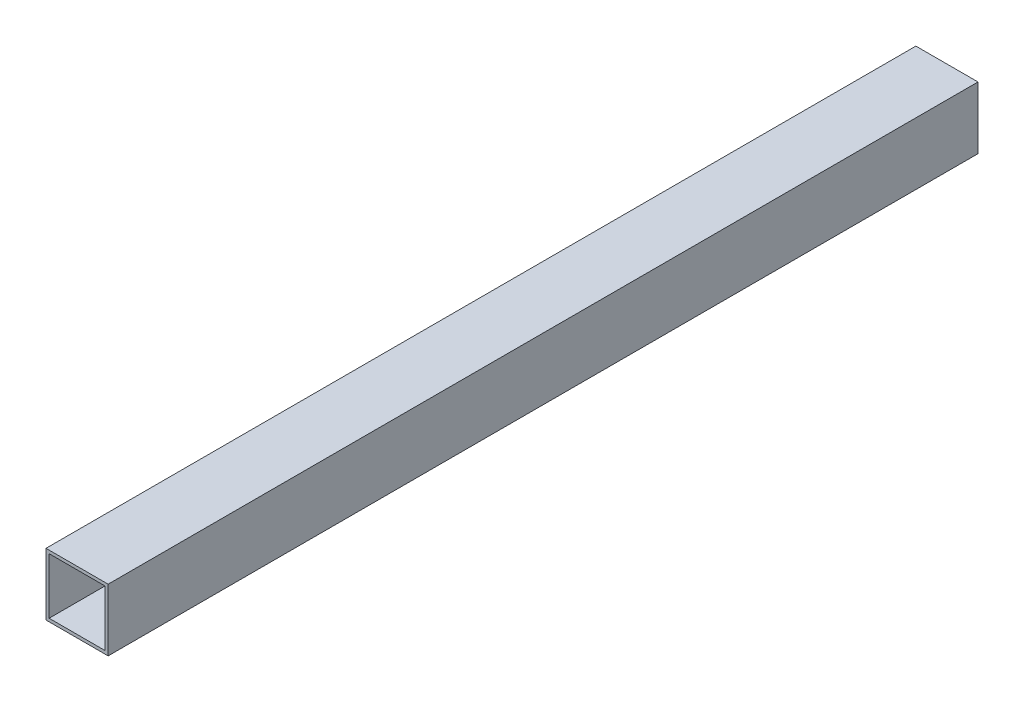
ISO-10303-21;
HEADER;
FILE_DESCRIPTION(('STEP AP214'),'2;1');
FILE_NAME('part.step','',(''),(''),'','','');
FILE_SCHEMA(('AUTOMOTIVE_DESIGN { 1 0 10303 214 1 1 1 1 }'));
ENDSEC;
DATA;
#1=APPLICATION_CONTEXT('core data for automotive mechanical design processes');
#2=APPLICATION_PROTOCOL_DEFINITION('international standard','automotive_design',2000,#1);
#3=PRODUCT_CONTEXT('',#1,'mechanical');
#4=PRODUCT('Part','Part','',(#3));
#5=PRODUCT_RELATED_PRODUCT_CATEGORY('part','',(#4));
#6=PRODUCT_DEFINITION_FORMATION('','',#4);
#7=PRODUCT_DEFINITION_CONTEXT('part definition',#1,'design');
#8=PRODUCT_DEFINITION('design','',#6,#7);
#9=PRODUCT_DEFINITION_SHAPE('','',#8);
#10=(LENGTH_UNIT() NAMED_UNIT(*) SI_UNIT(.MILLI.,.METRE.));
#11=(NAMED_UNIT(*) PLANE_ANGLE_UNIT() SI_UNIT($,.RADIAN.));
#12=(NAMED_UNIT(*) SI_UNIT($,.STERADIAN.) SOLID_ANGLE_UNIT());
#13=UNCERTAINTY_MEASURE_WITH_UNIT(LENGTH_MEASURE(1.E-05),#10,'distance_accuracy_value','');
#14=(GEOMETRIC_REPRESENTATION_CONTEXT(3) GLOBAL_UNCERTAINTY_ASSIGNED_CONTEXT((#13)) GLOBAL_UNIT_ASSIGNED_CONTEXT((#10,
#11,#12)) REPRESENTATION_CONTEXT('',''));
#15=CARTESIAN_POINT('',(0.,0.,0.));
#16=DIRECTION('',(0.,0.,1.));
#17=DIRECTION('',(1.,0.,0.));
#18=AXIS2_PLACEMENT_3D('',#15,#16,#17);
#19=CARTESIAN_POINT('',(0.,0.,280.));
#20=DIRECTION('',(0.,0.,-1.));
#21=DIRECTION('',(-1.,0.,0.));
#22=AXIS2_PLACEMENT_3D('',#19,#20,#21);
#23=PLANE('',#22);
#24=DIRECTION('',(0.,1.,0.));
#25=VECTOR('',#24,1.);
#26=CARTESIAN_POINT('',(12.5,-7.5,280.));
#27=LINE('',#26,#25);
#28=CARTESIAN_POINT('',(12.5,-7.5,280.));
#29=VERTEX_POINT('',#28);
#30=CARTESIAN_POINT('',(12.5,12.5,280.));
#31=VERTEX_POINT('',#30);
#32=EDGE_CURVE('E143',#29,#31,#27,.T.);
#33=ORIENTED_EDGE('',*,*,#32,.T.);
#34=DIRECTION('',(-1.,0.,0.));
#35=VECTOR('',#34,1.);
#36=CARTESIAN_POINT('',(-7.5,12.5,280.));
#37=LINE('',#36,#35);
#38=CARTESIAN_POINT('',(-7.5,12.5,280.));
#39=VERTEX_POINT('',#38);
#40=EDGE_CURVE('E146',#31,#39,#37,.T.);
#41=ORIENTED_EDGE('',*,*,#40,.T.);
#42=DIRECTION('',(0.,-1.,0.));
#43=VECTOR('',#42,1.);
#44=CARTESIAN_POINT('',(-7.5,-7.5,280.));
#45=LINE('',#44,#43);
#46=CARTESIAN_POINT('',(-7.5,-7.5,280.));
#47=VERTEX_POINT('',#46);
#48=EDGE_CURVE('E149',#39,#47,#45,.T.);
#49=ORIENTED_EDGE('',*,*,#48,.T.);
#50=DIRECTION('',(1.,0.,0.));
#51=VECTOR('',#50,1.);
#52=CARTESIAN_POINT('',(-7.5,-7.5,280.));
#53=LINE('',#52,#51);
#54=EDGE_CURVE('E151',#47,#29,#53,.T.);
#55=ORIENTED_EDGE('',*,*,#54,.T.);
#56=EDGE_LOOP('',(#33,#41,#49,#55));
#57=FACE_BOUND('',#56,.T.);
#58=DIRECTION('',(0.,-1.,0.));
#59=VECTOR('',#58,1.);
#60=CARTESIAN_POINT('',(-6.5,-6.5,280.));
#61=LINE('',#60,#59);
#62=CARTESIAN_POINT('',(-6.5,11.5,280.));
#63=VERTEX_POINT('',#62);
#64=CARTESIAN_POINT('',(-6.5,-6.5,280.));
#65=VERTEX_POINT('',#64);
#66=EDGE_CURVE('E107',#63,#65,#61,.T.);
#67=ORIENTED_EDGE('',*,*,#66,.F.);
#68=DIRECTION('',(-1.,0.,0.));
#69=VECTOR('',#68,1.);
#70=CARTESIAN_POINT('',(-6.5,11.5,280.));
#71=LINE('',#70,#69);
#72=CARTESIAN_POINT('',(11.5,11.5,280.));
#73=VERTEX_POINT('',#72);
#74=EDGE_CURVE('E129',#73,#63,#71,.T.);
#75=ORIENTED_EDGE('',*,*,#74,.F.);
#76=DIRECTION('',(0.,1.,0.));
#77=VECTOR('',#76,1.);
#78=CARTESIAN_POINT('',(11.5,-6.5,280.));
#79=LINE('',#78,#77);
#80=CARTESIAN_POINT('',(11.5,-6.5,280.));
#81=VERTEX_POINT('',#80);
#82=EDGE_CURVE('E127',#81,#73,#79,.T.);
#83=ORIENTED_EDGE('',*,*,#82,.F.);
#84=DIRECTION('',(1.,0.,0.));
#85=VECTOR('',#84,1.);
#86=CARTESIAN_POINT('',(-6.5,-6.5,280.));
#87=LINE('',#86,#85);
#88=EDGE_CURVE('E115',#65,#81,#87,.T.);
#89=ORIENTED_EDGE('',*,*,#88,.F.);
#90=EDGE_LOOP('',(#67,#75,#83,#89));
#91=FACE_BOUND('',#90,.T.);
#92=ADVANCED_FACE('F42',(#57,#91),#23,.F.);
#93=CARTESIAN_POINT('',(0.,0.,0.));
#94=DIRECTION('',(0.,0.,-1.));
#95=DIRECTION('',(-1.,0.,0.));
#96=AXIS2_PLACEMENT_3D('',#93,#94,#95);
#97=PLANE('',#96);
#98=DIRECTION('',(0.,1.,0.));
#99=VECTOR('',#98,1.);
#100=CARTESIAN_POINT('',(12.5,-7.5,0.));
#101=LINE('',#100,#99);
#102=CARTESIAN_POINT('',(12.5,-7.5,0.));
#103=VERTEX_POINT('',#102);
#104=CARTESIAN_POINT('',(12.5,12.5,0.));
#105=VERTEX_POINT('',#104);
#106=EDGE_CURVE('E123',#103,#105,#101,.T.);
#107=ORIENTED_EDGE('',*,*,#106,.F.);
#108=DIRECTION('',(1.,0.,0.));
#109=VECTOR('',#108,1.);
#110=CARTESIAN_POINT('',(-7.5,-7.5,0.));
#111=LINE('',#110,#109);
#112=CARTESIAN_POINT('',(-7.5,-7.5,0.));
#113=VERTEX_POINT('',#112);
#114=EDGE_CURVE('E147',#113,#103,#111,.T.);
#115=ORIENTED_EDGE('',*,*,#114,.F.);
#116=DIRECTION('',(0.,-1.,0.));
#117=VECTOR('',#116,1.);
#118=CARTESIAN_POINT('',(-7.5,-7.5,0.));
#119=LINE('',#118,#117);
#120=CARTESIAN_POINT('',(-7.5,12.5,0.));
#121=VERTEX_POINT('',#120);
#122=EDGE_CURVE('E158',#121,#113,#119,.T.);
#123=ORIENTED_EDGE('',*,*,#122,.F.);
#124=DIRECTION('',(-1.,0.,0.));
#125=VECTOR('',#124,1.);
#126=CARTESIAN_POINT('',(-7.5,12.5,0.));
#127=LINE('',#126,#125);
#128=EDGE_CURVE('E156',#105,#121,#127,.T.);
#129=ORIENTED_EDGE('',*,*,#128,.F.);
#130=EDGE_LOOP('',(#107,#115,#123,#129));
#131=FACE_BOUND('',#130,.T.);
#132=DIRECTION('',(-1.,0.,0.));
#133=VECTOR('',#132,1.);
#134=CARTESIAN_POINT('',(-6.5,11.5,0.));
#135=LINE('',#134,#133);
#136=CARTESIAN_POINT('',(11.5,11.5,0.));
#137=VERTEX_POINT('',#136);
#138=CARTESIAN_POINT('',(-6.5,11.5,0.));
#139=VERTEX_POINT('',#138);
#140=EDGE_CURVE('E116',#137,#139,#135,.T.);
#141=ORIENTED_EDGE('',*,*,#140,.T.);
#142=DIRECTION('',(0.,-1.,0.));
#143=VECTOR('',#142,1.);
#144=CARTESIAN_POINT('',(-6.5,-6.5,0.));
#145=LINE('',#144,#143);
#146=CARTESIAN_POINT('',(-6.5,-6.5,0.));
#147=VERTEX_POINT('',#146);
#148=EDGE_CURVE('E65',#139,#147,#145,.T.);
#149=ORIENTED_EDGE('',*,*,#148,.T.);
#150=DIRECTION('',(1.,0.,0.));
#151=VECTOR('',#150,1.);
#152=CARTESIAN_POINT('',(-6.5,-6.5,0.));
#153=LINE('',#152,#151);
#154=CARTESIAN_POINT('',(11.5,-6.5,0.));
#155=VERTEX_POINT('',#154);
#156=EDGE_CURVE('E122',#147,#155,#153,.T.);
#157=ORIENTED_EDGE('',*,*,#156,.T.);
#158=DIRECTION('',(0.,1.,0.));
#159=VECTOR('',#158,1.);
#160=CARTESIAN_POINT('',(11.5,-6.5,0.));
#161=LINE('',#160,#159);
#162=EDGE_CURVE('E135',#155,#137,#161,.T.);
#163=ORIENTED_EDGE('',*,*,#162,.T.);
#164=EDGE_LOOP('',(#141,#149,#157,#163));
#165=FACE_BOUND('',#164,.T.);
#166=ADVANCED_FACE('F176',(#131,#165),#97,.T.);
#167=CARTESIAN_POINT('',(12.5,-7.5,280.));
#168=DIRECTION('',(-1.,0.,0.));
#169=DIRECTION('',(0.,0.,1.));
#170=AXIS2_PLACEMENT_3D('',#167,#168,#169);
#171=PLANE('',#170);
#172=ORIENTED_EDGE('',*,*,#106,.T.);
#173=DIRECTION('',(0.,0.,-1.));
#174=VECTOR('',#173,1.);
#175=CARTESIAN_POINT('',(12.5,12.5,280.));
#176=LINE('',#175,#174);
#177=EDGE_CURVE('E11',#31,#105,#176,.T.);
#178=ORIENTED_EDGE('',*,*,#177,.F.);
#179=ORIENTED_EDGE('',*,*,#32,.F.);
#180=DIRECTION('',(0.,0.,-1.));
#181=VECTOR('',#180,1.);
#182=CARTESIAN_POINT('',(12.5,-7.5,280.));
#183=LINE('',#182,#181);
#184=EDGE_CURVE('E153',#29,#103,#183,.T.);
#185=ORIENTED_EDGE('',*,*,#184,.T.);
#186=EDGE_LOOP('',(#172,#178,#179,#185));
#187=FACE_BOUND('',#186,.T.);
#188=ADVANCED_FACE('F44',(#187),#171,.F.);
#189=CARTESIAN_POINT('',(-7.5,12.5,280.));
#190=DIRECTION('',(0.,-1.,0.));
#191=DIRECTION('',(0.,0.,-1.));
#192=AXIS2_PLACEMENT_3D('',#189,#190,#191);
#193=PLANE('',#192);
#194=ORIENTED_EDGE('',*,*,#128,.T.);
#195=DIRECTION('',(0.,0.,-1.));
#196=VECTOR('',#195,1.);
#197=CARTESIAN_POINT('',(-7.5,12.5,280.));
#198=LINE('',#197,#196);
#199=EDGE_CURVE('E50',#39,#121,#198,.T.);
#200=ORIENTED_EDGE('',*,*,#199,.F.);
#201=ORIENTED_EDGE('',*,*,#40,.F.);
#202=ORIENTED_EDGE('',*,*,#177,.T.);
#203=EDGE_LOOP('',(#194,#200,#201,#202));
#204=FACE_BOUND('',#203,.T.);
#205=ADVANCED_FACE('F186',(#204),#193,.F.);
#206=CARTESIAN_POINT('',(-7.5,-7.5,280.));
#207=DIRECTION('',(1.,0.,0.));
#208=DIRECTION('',(0.,0.,-1.));
#209=AXIS2_PLACEMENT_3D('',#206,#207,#208);
#210=PLANE('',#209);
#211=ORIENTED_EDGE('',*,*,#122,.T.);
#212=DIRECTION('',(0.,0.,-1.));
#213=VECTOR('',#212,1.);
#214=CARTESIAN_POINT('',(-7.5,-7.5,280.));
#215=LINE('',#214,#213);
#216=EDGE_CURVE('E163',#47,#113,#215,.T.);
#217=ORIENTED_EDGE('',*,*,#216,.F.);
#218=ORIENTED_EDGE('',*,*,#48,.F.);
#219=ORIENTED_EDGE('',*,*,#199,.T.);
#220=EDGE_LOOP('',(#211,#217,#218,#219));
#221=FACE_BOUND('',#220,.T.);
#222=ADVANCED_FACE('F170',(#221),#210,.F.);
#223=CARTESIAN_POINT('',(-7.5,-7.5,280.));
#224=DIRECTION('',(0.,1.,0.));
#225=DIRECTION('',(0.,0.,1.));
#226=AXIS2_PLACEMENT_3D('',#223,#224,#225);
#227=PLANE('',#226);
#228=ORIENTED_EDGE('',*,*,#114,.T.);
#229=ORIENTED_EDGE('',*,*,#184,.F.);
#230=ORIENTED_EDGE('',*,*,#54,.F.);
#231=ORIENTED_EDGE('',*,*,#216,.T.);
#232=EDGE_LOOP('',(#228,#229,#230,#231));
#233=FACE_BOUND('',#232,.T.);
#234=ADVANCED_FACE('F180',(#233),#227,.F.);
#235=CARTESIAN_POINT('',(-6.5,-6.5,280.));
#236=DIRECTION('',(1.,0.,0.));
#237=DIRECTION('',(0.,0.,-1.));
#238=AXIS2_PLACEMENT_3D('',#235,#236,#237);
#239=PLANE('',#238);
#240=ORIENTED_EDGE('',*,*,#148,.F.);
#241=DIRECTION('',(0.,0.,-1.));
#242=VECTOR('',#241,1.);
#243=CARTESIAN_POINT('',(-6.5,11.5,280.));
#244=LINE('',#243,#242);
#245=EDGE_CURVE('E111',#63,#139,#244,.T.);
#246=ORIENTED_EDGE('',*,*,#245,.F.);
#247=ORIENTED_EDGE('',*,*,#66,.T.);
#248=DIRECTION('',(0.,0.,-1.));
#249=VECTOR('',#248,1.);
#250=CARTESIAN_POINT('',(-6.5,-6.5,280.));
#251=LINE('',#250,#249);
#252=EDGE_CURVE('E110',#65,#147,#251,.T.);
#253=ORIENTED_EDGE('',*,*,#252,.T.);
#254=EDGE_LOOP('',(#240,#246,#247,#253));
#255=FACE_BOUND('',#254,.T.);
#256=ADVANCED_FACE('F109',(#255),#239,.T.);
#257=CARTESIAN_POINT('',(-6.5,-6.5,280.));
#258=DIRECTION('',(0.,1.,0.));
#259=DIRECTION('',(0.,0.,1.));
#260=AXIS2_PLACEMENT_3D('',#257,#258,#259);
#261=PLANE('',#260);
#262=ORIENTED_EDGE('',*,*,#156,.F.);
#263=ORIENTED_EDGE('',*,*,#252,.F.);
#264=ORIENTED_EDGE('',*,*,#88,.T.);
#265=DIRECTION('',(0.,0.,-1.));
#266=VECTOR('',#265,1.);
#267=CARTESIAN_POINT('',(11.5,-6.5,280.));
#268=LINE('',#267,#266);
#269=EDGE_CURVE('E124',#81,#155,#268,.T.);
#270=ORIENTED_EDGE('',*,*,#269,.T.);
#271=EDGE_LOOP('',(#262,#263,#264,#270));
#272=FACE_BOUND('',#271,.T.);
#273=ADVANCED_FACE('F119',(#272),#261,.T.);
#274=CARTESIAN_POINT('',(11.5,-6.5,280.));
#275=DIRECTION('',(-1.,0.,0.));
#276=DIRECTION('',(0.,0.,1.));
#277=AXIS2_PLACEMENT_3D('',#274,#275,#276);
#278=PLANE('',#277);
#279=ORIENTED_EDGE('',*,*,#162,.F.);
#280=ORIENTED_EDGE('',*,*,#269,.F.);
#281=ORIENTED_EDGE('',*,*,#82,.T.);
#282=DIRECTION('',(0.,0.,-1.));
#283=VECTOR('',#282,1.);
#284=CARTESIAN_POINT('',(11.5,11.5,280.));
#285=LINE('',#284,#283);
#286=EDGE_CURVE('E57',#73,#137,#285,.T.);
#287=ORIENTED_EDGE('',*,*,#286,.T.);
#288=EDGE_LOOP('',(#279,#280,#281,#287));
#289=FACE_BOUND('',#288,.T.);
#290=ADVANCED_FACE('F209',(#289),#278,.T.);
#291=CARTESIAN_POINT('',(-6.5,11.5,280.));
#292=DIRECTION('',(0.,-1.,0.));
#293=DIRECTION('',(1.,0.,0.));
#294=AXIS2_PLACEMENT_3D('',#291,#292,#293);
#295=PLANE('',#294);
#296=ORIENTED_EDGE('',*,*,#140,.F.);
#297=ORIENTED_EDGE('',*,*,#286,.F.);
#298=ORIENTED_EDGE('',*,*,#74,.T.);
#299=ORIENTED_EDGE('',*,*,#245,.T.);
#300=EDGE_LOOP('',(#296,#297,#298,#299));
#301=FACE_BOUND('',#300,.T.);
#302=ADVANCED_FACE('F213',(#301),#295,.T.);
#303=CLOSED_SHELL('',(#92,#166,#188,#205,#222,#234,#256,#273,#290,#302));
#304=MANIFOLD_SOLID_BREP('B2',#303);
#305=ADVANCED_BREP_SHAPE_REPRESENTATION('',(#18,#304),#14);
#306=SHAPE_DEFINITION_REPRESENTATION(#9,#305);
ENDSEC;
END-ISO-10303-21;
